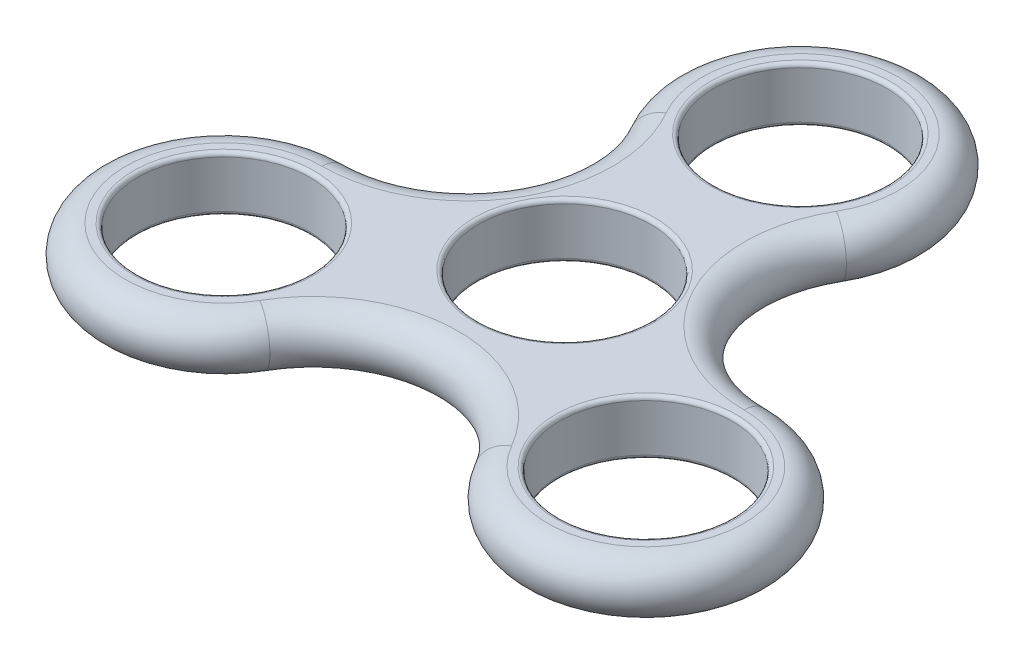
ISO-10303-21;
HEADER;
FILE_DESCRIPTION(('STEP AP214'),'2;1');
FILE_NAME('part.step','',(''),(''),'','','');
FILE_SCHEMA(('AUTOMOTIVE_DESIGN { 1 0 10303 214 1 1 1 1 }'));
ENDSEC;
DATA;
#1=APPLICATION_CONTEXT('core data for automotive mechanical design processes');
#2=APPLICATION_PROTOCOL_DEFINITION('international standard','automotive_design',2000,#1);
#3=PRODUCT_CONTEXT('',#1,'mechanical');
#4=PRODUCT('Part','Part','',(#3));
#5=PRODUCT_RELATED_PRODUCT_CATEGORY('part','',(#4));
#6=PRODUCT_DEFINITION_FORMATION('','',#4);
#7=PRODUCT_DEFINITION_CONTEXT('part definition',#1,'design');
#8=PRODUCT_DEFINITION('design','',#6,#7);
#9=PRODUCT_DEFINITION_SHAPE('','',#8);
#10=(LENGTH_UNIT() NAMED_UNIT(*) SI_UNIT(.MILLI.,.METRE.));
#11=(NAMED_UNIT(*) PLANE_ANGLE_UNIT() SI_UNIT($,.RADIAN.));
#12=(NAMED_UNIT(*) SI_UNIT($,.STERADIAN.) SOLID_ANGLE_UNIT());
#13=UNCERTAINTY_MEASURE_WITH_UNIT(LENGTH_MEASURE(1.E-05),#10,'distance_accuracy_value','');
#14=(GEOMETRIC_REPRESENTATION_CONTEXT(3) GLOBAL_UNCERTAINTY_ASSIGNED_CONTEXT((#13)) GLOBAL_UNIT_ASSIGNED_CONTEXT((#10,
#11,#12)) REPRESENTATION_CONTEXT('',''));
#15=CARTESIAN_POINT('',(0.,0.,0.));
#16=DIRECTION('',(0.,0.,1.));
#17=DIRECTION('',(1.,0.,0.));
#18=AXIS2_PLACEMENT_3D('',#15,#16,#17);
#19=CARTESIAN_POINT('',(26.8467875173201,0.,16.5));
#20=DIRECTION('',(0.,1.,0.));
#21=DIRECTION('',(0.,0.,1.));
#22=AXIS2_PLACEMENT_3D('',#19,#20,#21);
#23=TOROIDAL_SURFACE('',#22,12.5,3.5);
#24=CARTESIAN_POINT('',(26.8467875173201,0.,3.99999999999999));
#25=DIRECTION('',(-1.,0.,0.));
#26=DIRECTION('',(0.,0.,1.));
#27=AXIS2_PLACEMENT_3D('',#24,#25,#26);
#28=CIRCLE('',#27,3.5);
#29=CARTESIAN_POINT('',(26.8467875173201,3.5,4.));
#30=VERTEX_POINT('',#29);
#31=CARTESIAN_POINT('',(26.8467875173201,-3.5,3.99999999999999));
#32=VERTEX_POINT('',#31);
#33=EDGE_CURVE('E113',#30,#32,#28,.T.);
#34=ORIENTED_EDGE('',*,*,#33,.F.);
#35=CARTESIAN_POINT('',(26.8467875173201,3.5,16.5));
#36=DIRECTION('',(0.,1.,0.));
#37=DIRECTION('',(0.,0.,1.));
#38=AXIS2_PLACEMENT_3D('',#35,#36,#37);
#39=CIRCLE('',#38,12.5);
#40=CARTESIAN_POINT('',(16.0214699700146,3.5,22.75));
#41=VERTEX_POINT('',#40);
#42=EDGE_CURVE('E121',#41,#30,#39,.T.);
#43=ORIENTED_EDGE('',*,*,#42,.F.);
#44=CARTESIAN_POINT('',(16.0214699700146,0.,22.75));
#45=DIRECTION('',(0.500000000000001,0.,0.866025403784438));
#46=DIRECTION('',(0.866025403784438,0.,-0.500000000000001));
#47=AXIS2_PLACEMENT_3D('',#44,#45,#46);
#48=CIRCLE('',#47,3.5);
#49=CARTESIAN_POINT('',(16.0214699700146,-3.5,22.75));
#50=VERTEX_POINT('',#49);
#51=EDGE_CURVE('E102',#41,#50,#48,.T.);
#52=ORIENTED_EDGE('',*,*,#51,.T.);
#53=CARTESIAN_POINT('',(26.8467875173201,-3.5,16.5));
#54=DIRECTION('',(0.,1.,0.));
#55=DIRECTION('',(0.,0.,1.));
#56=AXIS2_PLACEMENT_3D('',#53,#54,#55);
#57=CIRCLE('',#56,12.5);
#58=EDGE_CURVE('E143',#32,#50,#57,.F.);
#59=ORIENTED_EDGE('',*,*,#58,.F.);
#60=EDGE_LOOP('',(#34,#43,#52,#59));
#61=FACE_BOUND('',#60,.T.);
#62=ADVANCED_FACE('F47',(#61),#23,.T.);
#63=CARTESIAN_POINT('',(2.46790047741526E-12,0.,32.));
#64=DIRECTION('',(0.,-1.,0.));
#65=DIRECTION('',(0.,0.,-1.));
#66=AXIS2_PLACEMENT_3D('',#63,#64,#65);
#67=TOROIDAL_SURFACE('',#66,18.5,3.5);
#68=ORIENTED_EDGE('',*,*,#51,.F.);
#69=CARTESIAN_POINT('',(2.46790047741526E-12,3.5,32.));
#70=DIRECTION('',(0.,1.,0.));
#71=DIRECTION('',(0.,0.,1.));
#72=AXIS2_PLACEMENT_3D('',#69,#70,#71);
#73=CIRCLE('',#72,18.5);
#74=CARTESIAN_POINT('',(-16.0214699700104,3.5,22.7500000000013));
#75=VERTEX_POINT('',#74);
#76=EDGE_CURVE('E105',#75,#41,#73,.F.);
#77=ORIENTED_EDGE('',*,*,#76,.F.);
#78=CARTESIAN_POINT('',(-16.0214699700104,0.,22.7500000000013));
#79=DIRECTION('',(0.499999999999931,0.,-0.866025403784478));
#80=DIRECTION('',(-0.866025403784479,0.,-0.499999999999931));
#81=AXIS2_PLACEMENT_3D('',#78,#79,#80);
#82=CIRCLE('',#81,3.5);
#83=CARTESIAN_POINT('',(-16.0214699700104,-3.5,22.7500000000013));
#84=VERTEX_POINT('',#83);
#85=EDGE_CURVE('E114',#75,#84,#82,.T.);
#86=ORIENTED_EDGE('',*,*,#85,.T.);
#87=CARTESIAN_POINT('',(2.46790047741526E-12,-3.5,32.));
#88=DIRECTION('',(0.,1.,0.));
#89=DIRECTION('',(0.,0.,1.));
#90=AXIS2_PLACEMENT_3D('',#87,#88,#89);
#91=CIRCLE('',#90,18.5);
#92=EDGE_CURVE('E107',#50,#84,#91,.T.);
#93=ORIENTED_EDGE('',*,*,#92,.F.);
#94=EDGE_LOOP('',(#68,#77,#86,#93));
#95=FACE_BOUND('',#94,.T.);
#96=ADVANCED_FACE('F104',(#95),#67,.T.);
#97=CARTESIAN_POINT('',(-26.8467875173164,0.,16.5000000000021));
#98=DIRECTION('',(0.,1.,0.));
#99=DIRECTION('',(0.,0.,1.));
#100=AXIS2_PLACEMENT_3D('',#97,#98,#99);
#101=TOROIDAL_SURFACE('',#100,12.5,3.5);
#102=ORIENTED_EDGE('',*,*,#85,.F.);
#103=CARTESIAN_POINT('',(-26.8467875173164,3.5,16.5000000000021));
#104=DIRECTION('',(0.,1.,0.));
#105=DIRECTION('',(0.,0.,1.));
#106=AXIS2_PLACEMENT_3D('',#103,#104,#105);
#107=CIRCLE('',#106,12.5);
#108=CARTESIAN_POINT('',(-26.8467875173164,3.5,4.00000000000214));
#109=VERTEX_POINT('',#108);
#110=EDGE_CURVE('E124',#109,#75,#107,.T.);
#111=ORIENTED_EDGE('',*,*,#110,.F.);
#112=CARTESIAN_POINT('',(-26.8467875173164,0.,4.00000000000214));
#113=DIRECTION('',(-1.,0.,0.));
#114=DIRECTION('',(0.,-1.,0.));
#115=AXIS2_PLACEMENT_3D('',#112,#113,#114);
#116=CIRCLE('',#115,3.5);
#117=CARTESIAN_POINT('',(-26.8467875173164,-3.5,4.00000000000214));
#118=VERTEX_POINT('',#117);
#119=EDGE_CURVE('E168',#109,#118,#116,.T.);
#120=ORIENTED_EDGE('',*,*,#119,.T.);
#121=CARTESIAN_POINT('',(-26.8467875173164,-3.5,16.5000000000021));
#122=DIRECTION('',(0.,1.,0.));
#123=DIRECTION('',(0.,0.,1.));
#124=AXIS2_PLACEMENT_3D('',#121,#122,#123);
#125=CIRCLE('',#124,12.5);
#126=EDGE_CURVE('E148',#84,#118,#125,.F.);
#127=ORIENTED_EDGE('',*,*,#126,.F.);
#128=EDGE_LOOP('',(#102,#111,#120,#127));
#129=FACE_BOUND('',#128,.T.);
#130=ADVANCED_FACE('F250',(#129),#101,.T.);
#131=CARTESIAN_POINT('',(-26.8467875173164,0.,-14.4999999999979));
#132=DIRECTION('',(0.,-1.,0.));
#133=DIRECTION('',(0.,0.,-1.));
#134=AXIS2_PLACEMENT_3D('',#131,#132,#133);
#135=TOROIDAL_SURFACE('',#134,18.5,3.5);
#136=ORIENTED_EDGE('',*,*,#119,.F.);
#137=CARTESIAN_POINT('',(-26.8467875173164,3.5,-14.4999999999979));
#138=DIRECTION('',(0.,1.,0.));
#139=DIRECTION('',(0.,0.,1.));
#140=AXIS2_PLACEMENT_3D('',#137,#138,#139);
#141=CIRCLE('',#140,18.5);
#142=CARTESIAN_POINT('',(-10.825317547305,3.5,-23.7499999999991));
#143=VERTEX_POINT('',#142);
#144=EDGE_CURVE('E133',#143,#109,#141,.F.);
#145=ORIENTED_EDGE('',*,*,#144,.F.);
#146=CARTESIAN_POINT('',(-10.825317547305,0.,-23.7499999999991));
#147=DIRECTION('',(0.500000000000069,0.,0.866025403784399));
#148=DIRECTION('',(0.866025403784399,0.,-0.500000000000069));
#149=AXIS2_PLACEMENT_3D('',#146,#147,#148);
#150=CIRCLE('',#149,3.5);
#151=CARTESIAN_POINT('',(-10.825317547305,-3.5,-23.7499999999991));
#152=VERTEX_POINT('',#151);
#153=EDGE_CURVE('E71',#143,#152,#150,.T.);
#154=ORIENTED_EDGE('',*,*,#153,.T.);
#155=CARTESIAN_POINT('',(-26.8467875173164,-3.5,-14.4999999999979));
#156=DIRECTION('',(0.,1.,0.));
#157=DIRECTION('',(0.,0.,1.));
#158=AXIS2_PLACEMENT_3D('',#155,#156,#157);
#159=CIRCLE('',#158,18.5);
#160=EDGE_CURVE('E152',#118,#152,#159,.T.);
#161=ORIENTED_EDGE('',*,*,#160,.F.);
#162=EDGE_LOOP('',(#136,#145,#154,#161));
#163=FACE_BOUND('',#162,.T.);
#164=ADVANCED_FACE('F317',(#163),#135,.T.);
#165=CARTESIAN_POINT('',(0.,0.,-30.));
#166=DIRECTION('',(0.,1.,0.));
#167=DIRECTION('',(0.,0.,1.));
#168=AXIS2_PLACEMENT_3D('',#165,#166,#167);
#169=TOROIDAL_SURFACE('',#168,12.5,3.5);
#170=ORIENTED_EDGE('',*,*,#153,.F.);
#171=CARTESIAN_POINT('',(0.,3.5,-30.));
#172=DIRECTION('',(0.,1.,0.));
#173=DIRECTION('',(0.,0.,1.));
#174=AXIS2_PLACEMENT_3D('',#171,#172,#173);
#175=CIRCLE('',#174,12.5);
#176=CARTESIAN_POINT('',(10.825317547306,3.5,-23.7500000000009));
#177=VERTEX_POINT('',#176);
#178=EDGE_CURVE('E136',#177,#143,#175,.T.);
#179=ORIENTED_EDGE('',*,*,#178,.F.);
#180=CARTESIAN_POINT('',(10.825317547306,0.,-23.7500000000009));
#181=DIRECTION('',(0.499999999999932,0.,-0.866025403784478));
#182=DIRECTION('',(-0.866025403784478,0.,-0.499999999999932));
#183=AXIS2_PLACEMENT_3D('',#180,#181,#182);
#184=CIRCLE('',#183,3.5);
#185=CARTESIAN_POINT('',(10.825317547306,-3.5,-23.7500000000009));
#186=VERTEX_POINT('',#185);
#187=EDGE_CURVE('E63',#177,#186,#184,.T.);
#188=ORIENTED_EDGE('',*,*,#187,.T.);
#189=CARTESIAN_POINT('',(0.,-3.5,-30.));
#190=DIRECTION('',(0.,1.,0.));
#191=DIRECTION('',(0.,0.,1.));
#192=AXIS2_PLACEMENT_3D('',#189,#190,#191);
#193=CIRCLE('',#192,12.5);
#194=EDGE_CURVE('E156',#152,#186,#193,.F.);
#195=ORIENTED_EDGE('',*,*,#194,.F.);
#196=EDGE_LOOP('',(#170,#179,#188,#195));
#197=FACE_BOUND('',#196,.T.);
#198=ADVANCED_FACE('F310',(#197),#169,.T.);
#199=CARTESIAN_POINT('',(26.8467875173201,0.,-14.5000000000014));
#200=DIRECTION('',(0.,-1.,0.));
#201=DIRECTION('',(0.,0.,-1.));
#202=AXIS2_PLACEMENT_3D('',#199,#200,#201);
#203=TOROIDAL_SURFACE('',#202,18.5000000000014,3.5);
#204=CARTESIAN_POINT('',(26.8467875173201,3.5,-14.5000000000014));
#205=DIRECTION('',(0.,1.,0.));
#206=DIRECTION('',(0.,0.,1.));
#207=AXIS2_PLACEMENT_3D('',#204,#205,#206);
#208=CIRCLE('',#207,18.5000000000014);
#209=EDGE_CURVE('E140',#30,#177,#208,.F.);
#210=ORIENTED_EDGE('',*,*,#209,.F.);
#211=ORIENTED_EDGE('',*,*,#33,.T.);
#212=CARTESIAN_POINT('',(26.8467875173201,-3.5,-14.5000000000014));
#213=DIRECTION('',(0.,1.,0.));
#214=DIRECTION('',(0.,0.,1.));
#215=AXIS2_PLACEMENT_3D('',#212,#213,#214);
#216=CIRCLE('',#215,18.5000000000014);
#217=EDGE_CURVE('E160',#186,#32,#216,.T.);
#218=ORIENTED_EDGE('',*,*,#217,.F.);
#219=ORIENTED_EDGE('',*,*,#187,.F.);
#220=EDGE_LOOP('',(#210,#211,#218,#219));
#221=FACE_BOUND('',#220,.T.);
#222=ADVANCED_FACE('F299',(#221),#203,.T.);
#223=CARTESIAN_POINT('',(0.,3.5,-30.));
#224=DIRECTION('',(0.,-1.,0.));
#225=DIRECTION('',(0.,0.,-1.));
#226=AXIS2_PLACEMENT_3D('',#223,#224,#225);
#227=CYLINDRICAL_SURFACE('',#226,11.);
#228=CARTESIAN_POINT('',(0.,-3.,-30.));
#229=DIRECTION('',(0.,1.,0.));
#230=DIRECTION('',(0.,0.,1.));
#231=AXIS2_PLACEMENT_3D('',#228,#229,#230);
#232=CIRCLE('',#231,11.);
#233=CARTESIAN_POINT('',(0.,-3.,-19.));
#234=VERTEX_POINT('',#233);
#235=EDGE_CURVE('E11',#234,#234,#232,.F.);
#236=ORIENTED_EDGE('',*,*,#235,.T.);
#237=EDGE_LOOP('',(#236));
#238=FACE_BOUND('',#237,.T.);
#239=CARTESIAN_POINT('',(0.,3.,-30.));
#240=DIRECTION('',(0.,1.,0.));
#241=DIRECTION('',(0.,0.,1.));
#242=AXIS2_PLACEMENT_3D('',#239,#240,#241);
#243=CIRCLE('',#242,11.);
#244=CARTESIAN_POINT('',(0.,3.,-19.));
#245=VERTEX_POINT('',#244);
#246=EDGE_CURVE('E56',#245,#245,#243,.T.);
#247=ORIENTED_EDGE('',*,*,#246,.T.);
#248=EDGE_LOOP('',(#247));
#249=FACE_BOUND('',#248,.T.);
#250=ADVANCED_FACE('F234',(#238,#249),#227,.F.);
#251=CARTESIAN_POINT('',(0.,3.5,0.));
#252=DIRECTION('',(0.,-1.,0.));
#253=DIRECTION('',(0.,0.,-1.));
#254=AXIS2_PLACEMENT_3D('',#251,#252,#253);
#255=CYLINDRICAL_SURFACE('',#254,11.);
#256=CARTESIAN_POINT('',(0.,-3.,0.));
#257=DIRECTION('',(0.,1.,0.));
#258=DIRECTION('',(0.,0.,1.));
#259=AXIS2_PLACEMENT_3D('',#256,#257,#258);
#260=CIRCLE('',#259,11.);
#261=CARTESIAN_POINT('',(0.,-3.,11.));
#262=VERTEX_POINT('',#261);
#263=EDGE_CURVE('E227',#262,#262,#260,.F.);
#264=ORIENTED_EDGE('',*,*,#263,.T.);
#265=EDGE_LOOP('',(#264));
#266=FACE_BOUND('',#265,.T.);
#267=CARTESIAN_POINT('',(0.,3.,0.));
#268=DIRECTION('',(0.,1.,0.));
#269=DIRECTION('',(0.,0.,1.));
#270=AXIS2_PLACEMENT_3D('',#267,#268,#269);
#271=CIRCLE('',#270,11.);
#272=CARTESIAN_POINT('',(0.,3.,11.));
#273=VERTEX_POINT('',#272);
#274=EDGE_CURVE('E223',#273,#273,#271,.T.);
#275=ORIENTED_EDGE('',*,*,#274,.T.);
#276=EDGE_LOOP('',(#275));
#277=FACE_BOUND('',#276,.T.);
#278=ADVANCED_FACE('F287',(#266,#277),#255,.F.);
#279=CARTESIAN_POINT('',(-26.8467875173164,3.5,16.5000000000021));
#280=DIRECTION('',(0.,-1.,0.));
#281=DIRECTION('',(0.,0.,-1.));
#282=AXIS2_PLACEMENT_3D('',#279,#280,#281);
#283=CYLINDRICAL_SURFACE('',#282,11.);
#284=CARTESIAN_POINT('',(-26.8467875173164,-3.,16.5000000000021));
#285=DIRECTION('',(0.,1.,0.));
#286=DIRECTION('',(0.,0.,1.));
#287=AXIS2_PLACEMENT_3D('',#284,#285,#286);
#288=CIRCLE('',#287,11.);
#289=CARTESIAN_POINT('',(-26.8467875173164,-3.,27.5000000000021));
#290=VERTEX_POINT('',#289);
#291=EDGE_CURVE('E195',#290,#290,#288,.F.);
#292=ORIENTED_EDGE('',*,*,#291,.T.);
#293=EDGE_LOOP('',(#292));
#294=FACE_BOUND('',#293,.T.);
#295=CARTESIAN_POINT('',(-26.8467875173164,3.,16.5000000000021));
#296=DIRECTION('',(0.,1.,0.));
#297=DIRECTION('',(0.,0.,1.));
#298=AXIS2_PLACEMENT_3D('',#295,#296,#297);
#299=CIRCLE('',#298,11.);
#300=CARTESIAN_POINT('',(-26.8467875173164,3.,27.5000000000021));
#301=VERTEX_POINT('',#300);
#302=EDGE_CURVE('E191',#301,#301,#299,.T.);
#303=ORIENTED_EDGE('',*,*,#302,.T.);
#304=EDGE_LOOP('',(#303));
#305=FACE_BOUND('',#304,.T.);
#306=ADVANCED_FACE('F289',(#294,#305),#283,.F.);
#307=CARTESIAN_POINT('',(26.8467875173201,3.5,16.5));
#308=DIRECTION('',(0.,-1.,0.));
#309=DIRECTION('',(0.,0.,-1.));
#310=AXIS2_PLACEMENT_3D('',#307,#308,#309);
#311=CYLINDRICAL_SURFACE('',#310,11.);
#312=CARTESIAN_POINT('',(26.8467875173201,-3.,16.5));
#313=DIRECTION('',(0.,1.,0.));
#314=DIRECTION('',(0.,0.,1.));
#315=AXIS2_PLACEMENT_3D('',#312,#313,#314);
#316=CIRCLE('',#315,11.);
#317=CARTESIAN_POINT('',(26.8467875173201,-3.,27.5));
#318=VERTEX_POINT('',#317);
#319=EDGE_CURVE('E219',#318,#318,#316,.F.);
#320=ORIENTED_EDGE('',*,*,#319,.T.);
#321=EDGE_LOOP('',(#320));
#322=FACE_BOUND('',#321,.T.);
#323=CARTESIAN_POINT('',(26.8467875173201,3.,16.5));
#324=DIRECTION('',(0.,1.,0.));
#325=DIRECTION('',(0.,0.,1.));
#326=AXIS2_PLACEMENT_3D('',#323,#324,#325);
#327=CIRCLE('',#326,11.);
#328=CARTESIAN_POINT('',(26.8467875173201,3.,27.5));
#329=VERTEX_POINT('',#328);
#330=EDGE_CURVE('E215',#329,#329,#327,.T.);
#331=ORIENTED_EDGE('',*,*,#330,.T.);
#332=EDGE_LOOP('',(#331));
#333=FACE_BOUND('',#332,.T.);
#334=ADVANCED_FACE('F296',(#322,#333),#311,.F.);
#335=CARTESIAN_POINT('',(0.,3.5,0.));
#336=DIRECTION('',(0.,1.,0.));
#337=DIRECTION('',(0.,0.,1.));
#338=AXIS2_PLACEMENT_3D('',#335,#336,#337);
#339=PLANE('',#338);
#340=CARTESIAN_POINT('',(-26.8467875173164,3.5,16.5000000000021));
#341=DIRECTION('',(0.,1.,0.));
#342=DIRECTION('',(0.,0.,1.));
#343=AXIS2_PLACEMENT_3D('',#340,#341,#342);
#344=CIRCLE('',#343,11.5);
#345=CARTESIAN_POINT('',(-26.8467875173164,3.5,28.0000000000021));
#346=VERTEX_POINT('',#345);
#347=EDGE_CURVE('E211',#346,#346,#344,.F.);
#348=ORIENTED_EDGE('',*,*,#347,.T.);
#349=EDGE_LOOP('',(#348));
#350=FACE_BOUND('',#349,.T.);
#351=CARTESIAN_POINT('',(26.8467875173201,3.5,16.5));
#352=DIRECTION('',(0.,1.,0.));
#353=DIRECTION('',(0.,0.,1.));
#354=AXIS2_PLACEMENT_3D('',#351,#352,#353);
#355=CIRCLE('',#354,11.5);
#356=CARTESIAN_POINT('',(26.8467875173201,3.5,28.));
#357=VERTEX_POINT('',#356);
#358=EDGE_CURVE('E207',#357,#357,#355,.F.);
#359=ORIENTED_EDGE('',*,*,#358,.T.);
#360=EDGE_LOOP('',(#359));
#361=FACE_BOUND('',#360,.T.);
#362=CARTESIAN_POINT('',(0.,3.5,0.));
#363=DIRECTION('',(0.,1.,0.));
#364=DIRECTION('',(0.,0.,1.));
#365=AXIS2_PLACEMENT_3D('',#362,#363,#364);
#366=CIRCLE('',#365,11.5);
#367=CARTESIAN_POINT('',(0.,3.5,11.5));
#368=VERTEX_POINT('',#367);
#369=EDGE_CURVE('E203',#368,#368,#366,.F.);
#370=ORIENTED_EDGE('',*,*,#369,.T.);
#371=EDGE_LOOP('',(#370));
#372=FACE_BOUND('',#371,.T.);
#373=CARTESIAN_POINT('',(0.,3.5,-30.));
#374=DIRECTION('',(0.,1.,0.));
#375=DIRECTION('',(0.,0.,1.));
#376=AXIS2_PLACEMENT_3D('',#373,#374,#375);
#377=CIRCLE('',#376,11.5);
#378=CARTESIAN_POINT('',(0.,3.5,-18.5));
#379=VERTEX_POINT('',#378);
#380=EDGE_CURVE('E199',#379,#379,#377,.F.);
#381=ORIENTED_EDGE('',*,*,#380,.T.);
#382=EDGE_LOOP('',(#381));
#383=FACE_BOUND('',#382,.T.);
#384=ORIENTED_EDGE('',*,*,#42,.T.);
#385=ORIENTED_EDGE('',*,*,#209,.T.);
#386=ORIENTED_EDGE('',*,*,#178,.T.);
#387=ORIENTED_EDGE('',*,*,#144,.T.);
#388=ORIENTED_EDGE('',*,*,#110,.T.);
#389=ORIENTED_EDGE('',*,*,#76,.T.);
#390=EDGE_LOOP('',(#384,#385,#386,#387,#388,#389));
#391=FACE_BOUND('',#390,.T.);
#392=ADVANCED_FACE('F119',(#350,#361,#372,#383,#391),#339,.T.);
#393=CARTESIAN_POINT('',(0.,-3.5,0.));
#394=DIRECTION('',(0.,1.,0.));
#395=DIRECTION('',(0.,0.,1.));
#396=AXIS2_PLACEMENT_3D('',#393,#394,#395);
#397=PLANE('',#396);
#398=CARTESIAN_POINT('',(-26.8467875173164,-3.5,16.5000000000021));
#399=DIRECTION('',(0.,1.,0.));
#400=DIRECTION('',(0.,0.,1.));
#401=AXIS2_PLACEMENT_3D('',#398,#399,#400);
#402=CIRCLE('',#401,11.5);
#403=CARTESIAN_POINT('',(-26.8467875173164,-3.5,28.0000000000021));
#404=VERTEX_POINT('',#403);
#405=EDGE_CURVE('E187',#404,#404,#402,.T.);
#406=ORIENTED_EDGE('',*,*,#405,.T.);
#407=EDGE_LOOP('',(#406));
#408=FACE_BOUND('',#407,.T.);
#409=CARTESIAN_POINT('',(26.8467875173201,-3.5,16.5));
#410=DIRECTION('',(0.,1.,0.));
#411=DIRECTION('',(0.,0.,1.));
#412=AXIS2_PLACEMENT_3D('',#409,#410,#411);
#413=CIRCLE('',#412,11.5);
#414=CARTESIAN_POINT('',(26.8467875173201,-3.5,28.));
#415=VERTEX_POINT('',#414);
#416=EDGE_CURVE('E183',#415,#415,#413,.T.);
#417=ORIENTED_EDGE('',*,*,#416,.T.);
#418=EDGE_LOOP('',(#417));
#419=FACE_BOUND('',#418,.T.);
#420=CARTESIAN_POINT('',(0.,-3.5,0.));
#421=DIRECTION('',(0.,1.,0.));
#422=DIRECTION('',(0.,0.,1.));
#423=AXIS2_PLACEMENT_3D('',#420,#421,#422);
#424=CIRCLE('',#423,11.5);
#425=CARTESIAN_POINT('',(0.,-3.5,11.5));
#426=VERTEX_POINT('',#425);
#427=EDGE_CURVE('E179',#426,#426,#424,.T.);
#428=ORIENTED_EDGE('',*,*,#427,.T.);
#429=EDGE_LOOP('',(#428));
#430=FACE_BOUND('',#429,.T.);
#431=CARTESIAN_POINT('',(0.,-3.5,-30.));
#432=DIRECTION('',(0.,1.,0.));
#433=DIRECTION('',(0.,0.,1.));
#434=AXIS2_PLACEMENT_3D('',#431,#432,#433);
#435=CIRCLE('',#434,11.5);
#436=CARTESIAN_POINT('',(0.,-3.5,-18.5));
#437=VERTEX_POINT('',#436);
#438=EDGE_CURVE('E175',#437,#437,#435,.T.);
#439=ORIENTED_EDGE('',*,*,#438,.T.);
#440=EDGE_LOOP('',(#439));
#441=FACE_BOUND('',#440,.T.);
#442=ORIENTED_EDGE('',*,*,#194,.T.);
#443=ORIENTED_EDGE('',*,*,#217,.T.);
#444=ORIENTED_EDGE('',*,*,#58,.T.);
#445=ORIENTED_EDGE('',*,*,#92,.T.);
#446=ORIENTED_EDGE('',*,*,#126,.T.);
#447=ORIENTED_EDGE('',*,*,#160,.T.);
#448=EDGE_LOOP('',(#442,#443,#444,#445,#446,#447));
#449=FACE_BOUND('',#448,.T.);
#450=ADVANCED_FACE('F262',(#408,#419,#430,#441,#449),#397,.F.);
#451=CARTESIAN_POINT('',(-26.8467875173164,-3.,16.5000000000021));
#452=DIRECTION('',(0.,1.,0.));
#453=DIRECTION('',(0.,0.,1.));
#454=AXIS2_PLACEMENT_3D('',#451,#452,#453);
#455=TOROIDAL_SURFACE('',#454,11.5,0.5);
#456=ORIENTED_EDGE('',*,*,#291,.F.);
#457=EDGE_LOOP('',(#456));
#458=FACE_BOUND('',#457,.T.);
#459=ORIENTED_EDGE('',*,*,#405,.F.);
#460=EDGE_LOOP('',(#459));
#461=FACE_BOUND('',#460,.T.);
#462=ADVANCED_FACE('F258',(#458,#461),#455,.T.);
#463=CARTESIAN_POINT('',(-26.8467875173164,3.,16.5000000000021));
#464=DIRECTION('',(0.,1.,0.));
#465=DIRECTION('',(0.,0.,1.));
#466=AXIS2_PLACEMENT_3D('',#463,#464,#465);
#467=TOROIDAL_SURFACE('',#466,11.5,0.5);
#468=ORIENTED_EDGE('',*,*,#347,.F.);
#469=EDGE_LOOP('',(#468));
#470=FACE_BOUND('',#469,.T.);
#471=ORIENTED_EDGE('',*,*,#302,.F.);
#472=EDGE_LOOP('',(#471));
#473=FACE_BOUND('',#472,.T.);
#474=ADVANCED_FACE('F261',(#470,#473),#467,.T.);
#475=CARTESIAN_POINT('',(26.8467875173201,-3.,16.5));
#476=DIRECTION('',(0.,1.,0.));
#477=DIRECTION('',(0.,0.,1.));
#478=AXIS2_PLACEMENT_3D('',#475,#476,#477);
#479=TOROIDAL_SURFACE('',#478,11.5,0.5);
#480=ORIENTED_EDGE('',*,*,#319,.F.);
#481=EDGE_LOOP('',(#480));
#482=FACE_BOUND('',#481,.T.);
#483=ORIENTED_EDGE('',*,*,#416,.F.);
#484=EDGE_LOOP('',(#483));
#485=FACE_BOUND('',#484,.T.);
#486=ADVANCED_FACE('F266',(#482,#485),#479,.T.);
#487=CARTESIAN_POINT('',(26.8467875173201,3.,16.5));
#488=DIRECTION('',(0.,1.,0.));
#489=DIRECTION('',(0.,0.,1.));
#490=AXIS2_PLACEMENT_3D('',#487,#488,#489);
#491=TOROIDAL_SURFACE('',#490,11.5,0.5);
#492=ORIENTED_EDGE('',*,*,#358,.F.);
#493=EDGE_LOOP('',(#492));
#494=FACE_BOUND('',#493,.T.);
#495=ORIENTED_EDGE('',*,*,#330,.F.);
#496=EDGE_LOOP('',(#495));
#497=FACE_BOUND('',#496,.T.);
#498=ADVANCED_FACE('F270',(#494,#497),#491,.T.);
#499=CARTESIAN_POINT('',(0.,-3.,0.));
#500=DIRECTION('',(0.,1.,0.));
#501=DIRECTION('',(0.,0.,1.));
#502=AXIS2_PLACEMENT_3D('',#499,#500,#501);
#503=TOROIDAL_SURFACE('',#502,11.5,0.5);
#504=ORIENTED_EDGE('',*,*,#263,.F.);
#505=EDGE_LOOP('',(#504));
#506=FACE_BOUND('',#505,.T.);
#507=ORIENTED_EDGE('',*,*,#427,.F.);
#508=EDGE_LOOP('',(#507));
#509=FACE_BOUND('',#508,.T.);
#510=ADVANCED_FACE('F274',(#506,#509),#503,.T.);
#511=CARTESIAN_POINT('',(0.,3.,0.));
#512=DIRECTION('',(0.,1.,0.));
#513=DIRECTION('',(0.,0.,1.));
#514=AXIS2_PLACEMENT_3D('',#511,#512,#513);
#515=TOROIDAL_SURFACE('',#514,11.5,0.5);
#516=ORIENTED_EDGE('',*,*,#369,.F.);
#517=EDGE_LOOP('',(#516));
#518=FACE_BOUND('',#517,.T.);
#519=ORIENTED_EDGE('',*,*,#274,.F.);
#520=EDGE_LOOP('',(#519));
#521=FACE_BOUND('',#520,.T.);
#522=ADVANCED_FACE('F242',(#518,#521),#515,.T.);
#523=CARTESIAN_POINT('',(0.,-3.,-30.));
#524=DIRECTION('',(0.,1.,0.));
#525=DIRECTION('',(0.,0.,1.));
#526=AXIS2_PLACEMENT_3D('',#523,#524,#525);
#527=TOROIDAL_SURFACE('',#526,11.5,0.5);
#528=ORIENTED_EDGE('',*,*,#235,.F.);
#529=EDGE_LOOP('',(#528));
#530=FACE_BOUND('',#529,.T.);
#531=ORIENTED_EDGE('',*,*,#438,.F.);
#532=EDGE_LOOP('',(#531));
#533=FACE_BOUND('',#532,.T.);
#534=ADVANCED_FACE('F237',(#530,#533),#527,.T.);
#535=CARTESIAN_POINT('',(0.,3.,-30.));
#536=DIRECTION('',(0.,1.,0.));
#537=DIRECTION('',(0.,0.,1.));
#538=AXIS2_PLACEMENT_3D('',#535,#536,#537);
#539=TOROIDAL_SURFACE('',#538,11.5,0.5);
#540=ORIENTED_EDGE('',*,*,#380,.F.);
#541=EDGE_LOOP('',(#540));
#542=FACE_BOUND('',#541,.T.);
#543=ORIENTED_EDGE('',*,*,#246,.F.);
#544=EDGE_LOOP('',(#543));
#545=FACE_BOUND('',#544,.T.);
#546=ADVANCED_FACE('F49',(#542,#545),#539,.T.);
#547=CLOSED_SHELL('',(#62,#96,#130,#164,#198,#222,#250,#278,#306,#334,#392,#450,#462,#474,#486,
#498,#510,#522,#534,#546));
#548=MANIFOLD_SOLID_BREP('B2',#547);
#549=ADVANCED_BREP_SHAPE_REPRESENTATION('',(#18,#548),#14);
#550=SHAPE_DEFINITION_REPRESENTATION(#9,#549);
ENDSEC;
END-ISO-10303-21;
